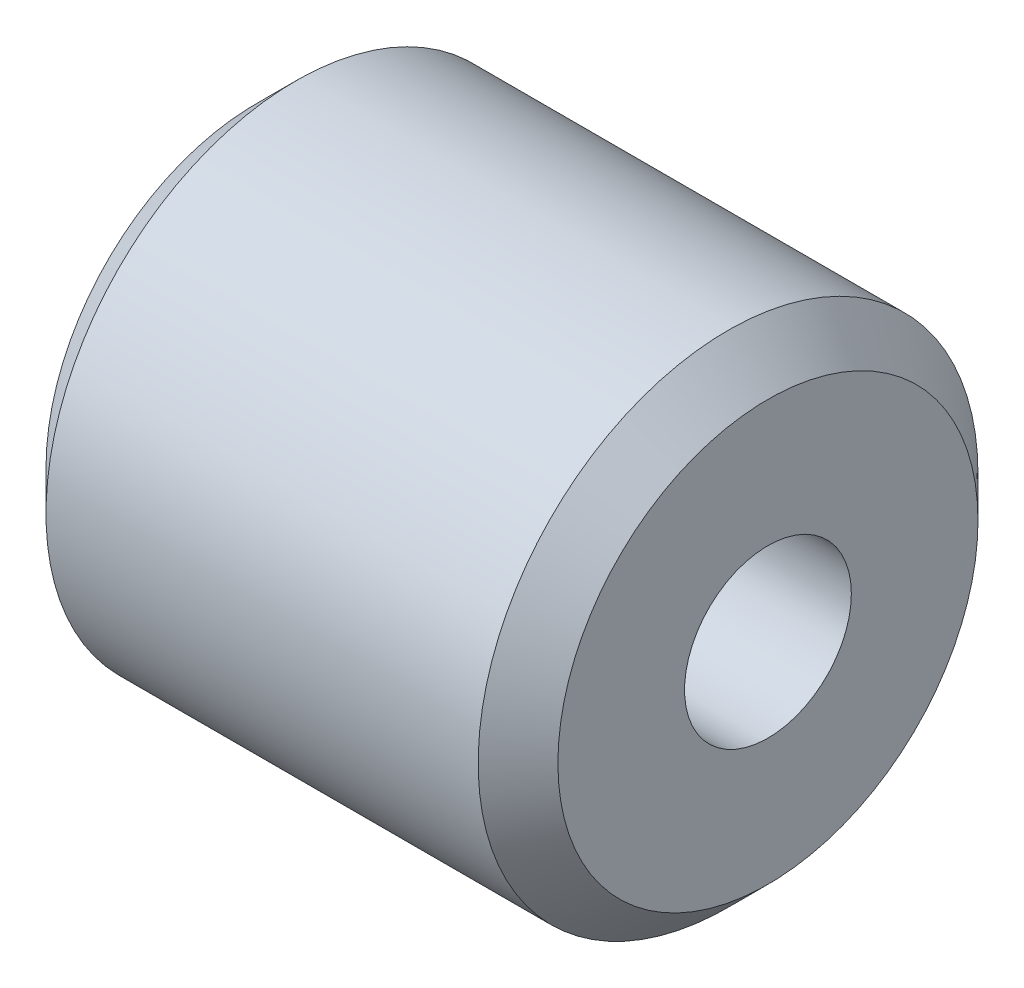
ISO-10303-21;
HEADER;
FILE_DESCRIPTION(('STEP AP214'),'2;1');
FILE_NAME('part.step','',(''),(''),'','','');
FILE_SCHEMA(('AUTOMOTIVE_DESIGN { 1 0 10303 214 1 1 1 1 }'));
ENDSEC;
DATA;
#1=APPLICATION_CONTEXT('core data for automotive mechanical design processes');
#2=APPLICATION_PROTOCOL_DEFINITION('international standard','automotive_design',2000,#1);
#3=PRODUCT_CONTEXT('',#1,'mechanical');
#4=PRODUCT('Part','Part','',(#3));
#5=PRODUCT_RELATED_PRODUCT_CATEGORY('part','',(#4));
#6=PRODUCT_DEFINITION_FORMATION('','',#4);
#7=PRODUCT_DEFINITION_CONTEXT('part definition',#1,'design');
#8=PRODUCT_DEFINITION('design','',#6,#7);
#9=PRODUCT_DEFINITION_SHAPE('','',#8);
#10=(LENGTH_UNIT() NAMED_UNIT(*) SI_UNIT(.MILLI.,.METRE.));
#11=(NAMED_UNIT(*) PLANE_ANGLE_UNIT() SI_UNIT($,.RADIAN.));
#12=(NAMED_UNIT(*) SI_UNIT($,.STERADIAN.) SOLID_ANGLE_UNIT());
#13=UNCERTAINTY_MEASURE_WITH_UNIT(LENGTH_MEASURE(1.E-05),#10,'distance_accuracy_value','');
#14=(GEOMETRIC_REPRESENTATION_CONTEXT(3) GLOBAL_UNCERTAINTY_ASSIGNED_CONTEXT((#13)) GLOBAL_UNIT_ASSIGNED_CONTEXT((#10,
#11,#12)) REPRESENTATION_CONTEXT('',''));
#15=CARTESIAN_POINT('',(0.,0.,0.));
#16=DIRECTION('',(0.,0.,1.));
#17=DIRECTION('',(1.,0.,0.));
#18=AXIS2_PLACEMENT_3D('',#15,#16,#17);
#19=CARTESIAN_POINT('',(4.88,0.,0.));
#20=DIRECTION('',(1.,0.,0.));
#21=DIRECTION('',(0.,0.,-1.));
#22=AXIS2_PLACEMENT_3D('',#19,#20,#21);
#23=PLANE('',#22);
#24=CARTESIAN_POINT('',(4.88,0.,0.));
#25=DIRECTION('',(1.,0.,0.));
#26=DIRECTION('',(0.,0.,-1.));
#27=AXIS2_PLACEMENT_3D('',#24,#25,#26);
#28=CIRCLE('',#27,4.005);
#29=CARTESIAN_POINT('',(4.88,0.,-4.005));
#30=VERTEX_POINT('',#29);
#31=EDGE_CURVE('E10',#30,#30,#28,.T.);
#32=ORIENTED_EDGE('',*,*,#31,.T.);
#33=EDGE_LOOP('',(#32));
#34=FACE_BOUND('',#33,.T.);
#35=CARTESIAN_POINT('',(4.88,0.,0.));
#36=DIRECTION('',(1.,0.,0.));
#37=DIRECTION('',(0.,0.,-1.));
#38=AXIS2_PLACEMENT_3D('',#35,#36,#37);
#39=CIRCLE('',#38,1.59);
#40=CARTESIAN_POINT('',(4.88,0.,-1.59));
#41=VERTEX_POINT('',#40);
#42=EDGE_CURVE('E55',#41,#41,#39,.T.);
#43=ORIENTED_EDGE('',*,*,#42,.F.);
#44=EDGE_LOOP('',(#43));
#45=FACE_BOUND('',#44,.T.);
#46=ADVANCED_FACE('F34',(#34,#45),#23,.T.);
#47=CARTESIAN_POINT('',(-4.88,0.,0.));
#48=DIRECTION('',(1.,0.,0.));
#49=DIRECTION('',(0.,0.,-1.));
#50=AXIS2_PLACEMENT_3D('',#47,#48,#49);
#51=PLANE('',#50);
#52=CARTESIAN_POINT('',(-4.88,0.,0.));
#53=DIRECTION('',(1.,0.,0.));
#54=DIRECTION('',(0.,0.,-1.));
#55=AXIS2_PLACEMENT_3D('',#52,#53,#54);
#56=CIRCLE('',#55,4.005);
#57=CARTESIAN_POINT('',(-4.88,0.,-4.005));
#58=VERTEX_POINT('',#57);
#59=EDGE_CURVE('E42',#58,#58,#56,.F.);
#60=ORIENTED_EDGE('',*,*,#59,.T.);
#61=EDGE_LOOP('',(#60));
#62=FACE_BOUND('',#61,.T.);
#63=CARTESIAN_POINT('',(-4.88,0.,0.));
#64=DIRECTION('',(1.,0.,0.));
#65=DIRECTION('',(0.,0.,-1.));
#66=AXIS2_PLACEMENT_3D('',#63,#64,#65);
#67=CIRCLE('',#66,1.59);
#68=CARTESIAN_POINT('',(-4.88,0.,-1.59));
#69=VERTEX_POINT('',#68);
#70=EDGE_CURVE('E56',#69,#69,#67,.T.);
#71=ORIENTED_EDGE('',*,*,#70,.T.);
#72=EDGE_LOOP('',(#71));
#73=FACE_BOUND('',#72,.T.);
#74=ADVANCED_FACE('F66',(#62,#73),#51,.F.);
#75=CARTESIAN_POINT('',(4.88,0.,0.));
#76=DIRECTION('',(-1.,0.,0.));
#77=DIRECTION('',(0.,0.,1.));
#78=AXIS2_PLACEMENT_3D('',#75,#76,#77);
#79=CYLINDRICAL_SURFACE('',#78,4.765);
#80=CARTESIAN_POINT('',(-4.12,0.,0.));
#81=DIRECTION('',(1.,0.,0.));
#82=DIRECTION('',(0.,0.,-1.));
#83=AXIS2_PLACEMENT_3D('',#80,#81,#82);
#84=CIRCLE('',#83,4.765);
#85=CARTESIAN_POINT('',(-4.12,0.,-4.765));
#86=VERTEX_POINT('',#85);
#87=EDGE_CURVE('E46',#86,#86,#84,.T.);
#88=ORIENTED_EDGE('',*,*,#87,.T.);
#89=EDGE_LOOP('',(#88));
#90=FACE_BOUND('',#89,.T.);
#91=CARTESIAN_POINT('',(4.12,0.,0.));
#92=DIRECTION('',(1.,0.,0.));
#93=DIRECTION('',(0.,0.,-1.));
#94=AXIS2_PLACEMENT_3D('',#91,#92,#93);
#95=CIRCLE('',#94,4.765);
#96=CARTESIAN_POINT('',(4.12,0.,-4.765));
#97=VERTEX_POINT('',#96);
#98=EDGE_CURVE('E50',#97,#97,#95,.F.);
#99=ORIENTED_EDGE('',*,*,#98,.T.);
#100=EDGE_LOOP('',(#99));
#101=FACE_BOUND('',#100,.T.);
#102=ADVANCED_FACE('F71',(#90,#101),#79,.T.);
#103=CARTESIAN_POINT('',(4.88,0.,0.));
#104=DIRECTION('',(-1.,0.,0.));
#105=DIRECTION('',(0.,0.,1.));
#106=AXIS2_PLACEMENT_3D('',#103,#104,#105);
#107=CYLINDRICAL_SURFACE('',#106,1.59);
#108=ORIENTED_EDGE('',*,*,#42,.T.);
#109=EDGE_LOOP('',(#108));
#110=FACE_BOUND('',#109,.T.);
#111=ORIENTED_EDGE('',*,*,#70,.F.);
#112=EDGE_LOOP('',(#111));
#113=FACE_BOUND('',#112,.T.);
#114=ADVANCED_FACE('F62',(#110,#113),#107,.F.);
#115=CARTESIAN_POINT('',(-4.12,0.,0.));
#116=DIRECTION('',(1.,0.,0.));
#117=DIRECTION('',(0.,0.,-1.));
#118=AXIS2_PLACEMENT_3D('',#115,#116,#117);
#119=CONICAL_SURFACE('',#118,4.765,0.78539816339745);
#120=ORIENTED_EDGE('',*,*,#59,.F.);
#121=EDGE_LOOP('',(#120));
#122=FACE_BOUND('',#121,.T.);
#123=ORIENTED_EDGE('',*,*,#87,.F.);
#124=EDGE_LOOP('',(#123));
#125=FACE_BOUND('',#124,.T.);
#126=ADVANCED_FACE('F78',(#122,#125),#119,.T.);
#127=CARTESIAN_POINT('',(4.88,0.,0.));
#128=DIRECTION('',(-1.,0.,0.));
#129=DIRECTION('',(0.,0.,1.));
#130=AXIS2_PLACEMENT_3D('',#127,#128,#129);
#131=CONICAL_SURFACE('',#130,4.005,0.785398163397448);
#132=ORIENTED_EDGE('',*,*,#98,.F.);
#133=EDGE_LOOP('',(#132));
#134=FACE_BOUND('',#133,.T.);
#135=ORIENTED_EDGE('',*,*,#31,.F.);
#136=EDGE_LOOP('',(#135));
#137=FACE_BOUND('',#136,.T.);
#138=ADVANCED_FACE('F37',(#134,#137),#131,.T.);
#139=CLOSED_SHELL('',(#46,#74,#102,#114,#126,#138));
#140=MANIFOLD_SOLID_BREP('B2',#139);
#141=ADVANCED_BREP_SHAPE_REPRESENTATION('',(#18,#140),#14);
#142=SHAPE_DEFINITION_REPRESENTATION(#9,#141);
ENDSEC;
END-ISO-10303-21;
